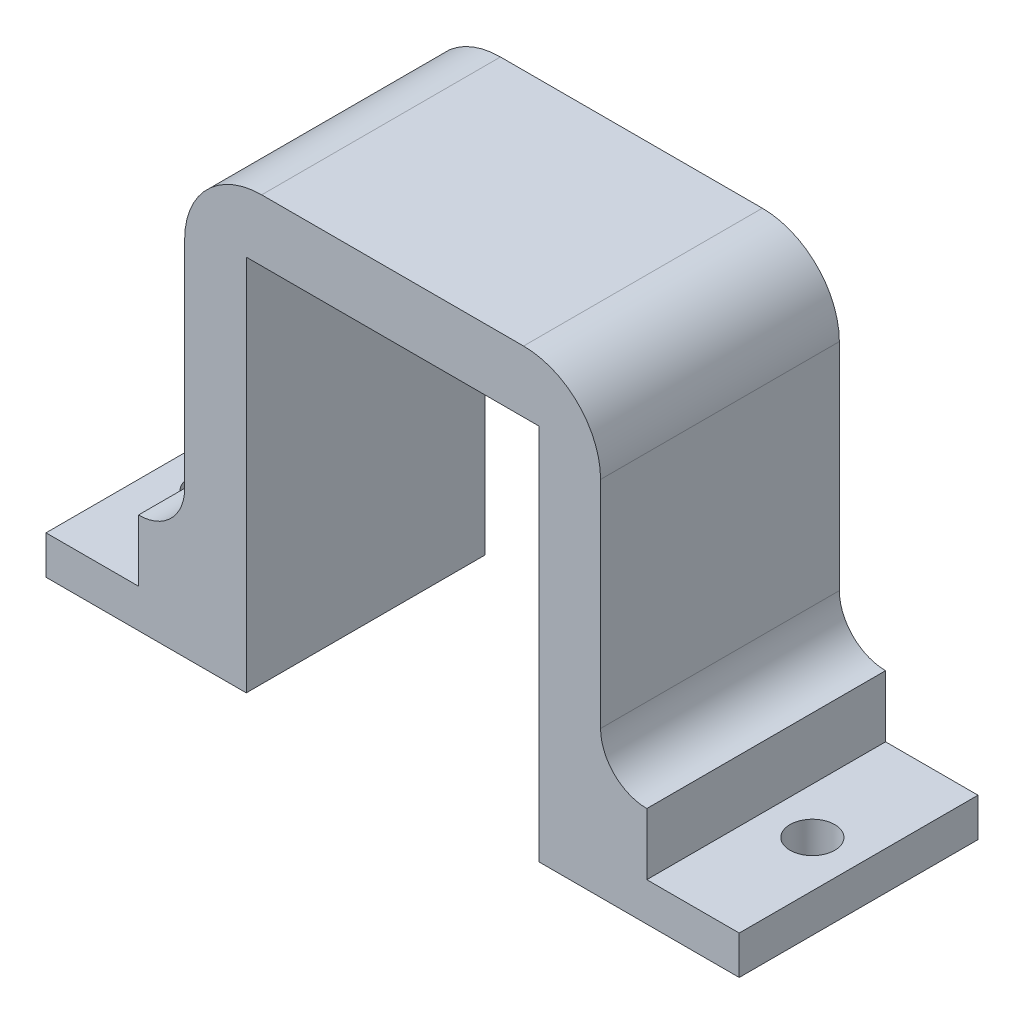
ISO-10303-21;
HEADER;
FILE_DESCRIPTION(('STEP AP214'),'2;1');
FILE_NAME('part.step','',(''),(''),'','','');
FILE_SCHEMA(('AUTOMOTIVE_DESIGN { 1 0 10303 214 1 1 1 1 }'));
ENDSEC;
DATA;
#1=APPLICATION_CONTEXT('core data for automotive mechanical design processes');
#2=APPLICATION_PROTOCOL_DEFINITION('international standard','automotive_design',2000,#1);
#3=PRODUCT_CONTEXT('',#1,'mechanical');
#4=PRODUCT('Part','Part','',(#3));
#5=PRODUCT_RELATED_PRODUCT_CATEGORY('part','',(#4));
#6=PRODUCT_DEFINITION_FORMATION('','',#4);
#7=PRODUCT_DEFINITION_CONTEXT('part definition',#1,'design');
#8=PRODUCT_DEFINITION('design','',#6,#7);
#9=PRODUCT_DEFINITION_SHAPE('','',#8);
#10=(LENGTH_UNIT() NAMED_UNIT(*) SI_UNIT(.MILLI.,.METRE.));
#11=(NAMED_UNIT(*) PLANE_ANGLE_UNIT() SI_UNIT($,.RADIAN.));
#12=(NAMED_UNIT(*) SI_UNIT($,.STERADIAN.) SOLID_ANGLE_UNIT());
#13=UNCERTAINTY_MEASURE_WITH_UNIT(LENGTH_MEASURE(1.E-05),#10,'distance_accuracy_value','');
#14=(GEOMETRIC_REPRESENTATION_CONTEXT(3) GLOBAL_UNCERTAINTY_ASSIGNED_CONTEXT((#13)) GLOBAL_UNIT_ASSIGNED_CONTEXT((#10,
#11,#12)) REPRESENTATION_CONTEXT('',''));
#15=CARTESIAN_POINT('',(0.,0.,0.));
#16=DIRECTION('',(0.,0.,1.));
#17=DIRECTION('',(1.,0.,0.));
#18=AXIS2_PLACEMENT_3D('',#15,#16,#17);
#19=CARTESIAN_POINT('',(0.,3.00000000000002,23.));
#20=DIRECTION('',(1.,0.,0.));
#21=DIRECTION('',(0.,0.,-1.));
#22=AXIS2_PLACEMENT_3D('',#19,#20,#21);
#23=PLANE('',#22);
#24=DIRECTION('',(0.,1.,0.));
#25=VECTOR('',#24,1.);
#26=CARTESIAN_POINT('',(0.,3.00000000000002,7.5));
#27=LINE('',#26,#25);
#28=CARTESIAN_POINT('',(0.,3.00000000000002,7.5));
#29=VERTEX_POINT('',#28);
#30=CARTESIAN_POINT('',(0.,17.,7.5));
#31=VERTEX_POINT('',#30);
#32=EDGE_CURVE('E292',#29,#31,#27,.T.);
#33=ORIENTED_EDGE('',*,*,#32,.F.);
#34=DIRECTION('',(0.,0.,-1.));
#35=VECTOR('',#34,1.);
#36=CARTESIAN_POINT('',(0.,3.00000000000002,23.));
#37=LINE('',#36,#35);
#38=CARTESIAN_POINT('',(0.,3.00000000000002,23.));
#39=VERTEX_POINT('',#38);
#40=EDGE_CURVE('E342',#39,#29,#37,.T.);
#41=ORIENTED_EDGE('',*,*,#40,.F.);
#42=DIRECTION('',(0.,-1.,0.));
#43=VECTOR('',#42,1.);
#44=CARTESIAN_POINT('',(0.,3.00000000000002,23.));
#45=LINE('',#44,#43);
#46=CARTESIAN_POINT('',(0.,17.,23.));
#47=VERTEX_POINT('',#46);
#48=EDGE_CURVE('E313',#47,#39,#45,.T.);
#49=ORIENTED_EDGE('',*,*,#48,.F.);
#50=DIRECTION('',(0.,0.,-1.));
#51=VECTOR('',#50,1.);
#52=CARTESIAN_POINT('',(0.,17.,23.));
#53=LINE('',#52,#51);
#54=EDGE_CURVE('E346',#47,#31,#53,.T.);
#55=ORIENTED_EDGE('',*,*,#54,.T.);
#56=EDGE_LOOP('',(#33,#41,#49,#55));
#57=FACE_BOUND('',#56,.T.);
#58=ADVANCED_FACE('F45',(#57),#23,.F.);
#59=CARTESIAN_POINT('',(-3.,3.,23.));
#60=DIRECTION('',(0.,0.,-1.));
#61=DIRECTION('',(-1.,0.,0.));
#62=AXIS2_PLACEMENT_3D('',#59,#60,#61);
#63=CYLINDRICAL_SURFACE('',#62,3.);
#64=CARTESIAN_POINT('',(-3.,3.,7.5));
#65=DIRECTION('',(0.,0.,-1.));
#66=DIRECTION('',(0.,1.,0.));
#67=AXIS2_PLACEMENT_3D('',#64,#65,#66);
#68=CIRCLE('',#67,3.);
#69=CARTESIAN_POINT('',(-3.00000000000002,0.,7.5));
#70=VERTEX_POINT('',#69);
#71=EDGE_CURVE('E289',#70,#29,#68,.F.);
#72=ORIENTED_EDGE('',*,*,#71,.F.);
#73=DIRECTION('',(0.,0.,-1.));
#74=VECTOR('',#73,1.);
#75=CARTESIAN_POINT('',(-3.00000000000002,0.,23.));
#76=LINE('',#75,#74);
#77=CARTESIAN_POINT('',(-3.,0.,23.));
#78=VERTEX_POINT('',#77);
#79=EDGE_CURVE('E339',#78,#70,#76,.T.);
#80=ORIENTED_EDGE('',*,*,#79,.F.);
#81=CARTESIAN_POINT('',(-3.,3.,23.));
#82=DIRECTION('',(0.,0.,-1.));
#83=DIRECTION('',(-1.,0.,0.));
#84=AXIS2_PLACEMENT_3D('',#81,#82,#83);
#85=CIRCLE('',#84,3.);
#86=EDGE_CURVE('E316',#39,#78,#85,.T.);
#87=ORIENTED_EDGE('',*,*,#86,.F.);
#88=ORIENTED_EDGE('',*,*,#40,.T.);
#89=EDGE_LOOP('',(#72,#80,#87,#88));
#90=FACE_BOUND('',#89,.T.);
#91=ADVANCED_FACE('F398',(#90),#63,.F.);
#92=CARTESIAN_POINT('',(-9.,-4.,23.));
#93=DIRECTION('',(1.,0.,0.));
#94=DIRECTION('',(0.,1.,0.));
#95=AXIS2_PLACEMENT_3D('',#92,#93,#94);
#96=PLANE('',#95);
#97=DIRECTION('',(0.,-1.,0.));
#98=VECTOR('',#97,1.);
#99=CARTESIAN_POINT('',(-9.,-4.,23.));
#100=LINE('',#99,#98);
#101=CARTESIAN_POINT('',(-9.,-3.99999999999999,23.));
#102=VERTEX_POINT('',#101);
#103=CARTESIAN_POINT('',(-8.99999999999999,-6.50000000000001,23.));
#104=VERTEX_POINT('',#103);
#105=EDGE_CURVE('E320',#102,#104,#100,.T.);
#106=ORIENTED_EDGE('',*,*,#105,.F.);
#107=DIRECTION('',(0.,0.,1.));
#108=VECTOR('',#107,1.);
#109=CARTESIAN_POINT('',(-9.,-3.99999999999999,7.5));
#110=LINE('',#109,#108);
#111=CARTESIAN_POINT('',(-9.,-3.99999999999999,7.5));
#112=VERTEX_POINT('',#111);
#113=EDGE_CURVE('E206',#112,#102,#110,.T.);
#114=ORIENTED_EDGE('',*,*,#113,.F.);
#115=DIRECTION('',(0.,1.,0.));
#116=VECTOR('',#115,1.);
#117=CARTESIAN_POINT('',(-9.,-4.,7.5));
#118=LINE('',#117,#116);
#119=CARTESIAN_POINT('',(-8.99999999999999,-6.50000000000001,7.5));
#120=VERTEX_POINT('',#119);
#121=EDGE_CURVE('E285',#120,#112,#118,.T.);
#122=ORIENTED_EDGE('',*,*,#121,.F.);
#123=DIRECTION('',(0.,0.,-1.));
#124=VECTOR('',#123,1.);
#125=CARTESIAN_POINT('',(-8.99999999999999,-6.50000000000001,23.));
#126=LINE('',#125,#124);
#127=EDGE_CURVE('E245',#104,#120,#126,.T.);
#128=ORIENTED_EDGE('',*,*,#127,.F.);
#129=EDGE_LOOP('',(#106,#114,#122,#128));
#130=FACE_BOUND('',#129,.T.);
#131=ADVANCED_FACE('F405',(#130),#96,.F.);
#132=CARTESIAN_POINT('',(4.,18.,23.));
#133=DIRECTION('',(-1.,0.,0.));
#134=DIRECTION('',(0.,-1.,0.));
#135=AXIS2_PLACEMENT_3D('',#132,#133,#134);
#136=PLANE('',#135);
#137=DIRECTION('',(0.,-1.,0.));
#138=VECTOR('',#137,1.);
#139=CARTESIAN_POINT('',(4.,18.,7.5));
#140=LINE('',#139,#138);
#141=CARTESIAN_POINT('',(4.,18.,7.5));
#142=VERTEX_POINT('',#141);
#143=CARTESIAN_POINT('',(4.,-6.50000000000001,7.5));
#144=VERTEX_POINT('',#143);
#145=EDGE_CURVE('E11',#142,#144,#140,.T.);
#146=ORIENTED_EDGE('',*,*,#145,.F.);
#147=DIRECTION('',(0.,0.,-1.));
#148=VECTOR('',#147,1.);
#149=CARTESIAN_POINT('',(4.,18.,23.));
#150=LINE('',#149,#148);
#151=CARTESIAN_POINT('',(4.,18.,23.));
#152=VERTEX_POINT('',#151);
#153=EDGE_CURVE('E335',#152,#142,#150,.T.);
#154=ORIENTED_EDGE('',*,*,#153,.F.);
#155=DIRECTION('',(0.,1.,0.));
#156=VECTOR('',#155,1.);
#157=CARTESIAN_POINT('',(4.,18.,23.));
#158=LINE('',#157,#156);
#159=CARTESIAN_POINT('',(4.,-6.50000000000001,23.));
#160=VERTEX_POINT('',#159);
#161=EDGE_CURVE('E323',#160,#152,#158,.T.);
#162=ORIENTED_EDGE('',*,*,#161,.F.);
#163=DIRECTION('',(0.,0.,1.));
#164=VECTOR('',#163,1.);
#165=CARTESIAN_POINT('',(4.,-6.50000000000001,23.));
#166=LINE('',#165,#164);
#167=EDGE_CURVE('E228',#144,#160,#166,.T.);
#168=ORIENTED_EDGE('',*,*,#167,.F.);
#169=EDGE_LOOP('',(#146,#154,#162,#168));
#170=FACE_BOUND('',#169,.T.);
#171=ADVANCED_FACE('F433',(#170),#136,.F.);
#172=CARTESIAN_POINT('',(36.,0.,23.));
#173=DIRECTION('',(-1.,0.,0.));
#174=DIRECTION('',(0.,0.,1.));
#175=AXIS2_PLACEMENT_3D('',#172,#173,#174);
#176=PLANE('',#175);
#177=DIRECTION('',(0.,1.,0.));
#178=VECTOR('',#177,1.);
#179=CARTESIAN_POINT('',(36.,-4.00000000000001,7.5));
#180=LINE('',#179,#178);
#181=CARTESIAN_POINT('',(36.,-6.5,7.5));
#182=VERTEX_POINT('',#181);
#183=CARTESIAN_POINT('',(36.,-4.,7.5));
#184=VERTEX_POINT('',#183);
#185=EDGE_CURVE('E259',#182,#184,#180,.T.);
#186=ORIENTED_EDGE('',*,*,#185,.T.);
#187=DIRECTION('',(0.,0.,-1.));
#188=VECTOR('',#187,1.);
#189=CARTESIAN_POINT('',(36.,-4.,23.));
#190=LINE('',#189,#188);
#191=CARTESIAN_POINT('',(36.,-4.,23.));
#192=VERTEX_POINT('',#191);
#193=EDGE_CURVE('E187',#192,#184,#190,.T.);
#194=ORIENTED_EDGE('',*,*,#193,.F.);
#195=DIRECTION('',(0.,1.,0.));
#196=VECTOR('',#195,1.);
#197=CARTESIAN_POINT('',(36.,0.,23.));
#198=LINE('',#197,#196);
#199=CARTESIAN_POINT('',(36.,-6.5,23.));
#200=VERTEX_POINT('',#199);
#201=EDGE_CURVE('E192',#200,#192,#198,.T.);
#202=ORIENTED_EDGE('',*,*,#201,.F.);
#203=DIRECTION('',(0.,0.,1.));
#204=VECTOR('',#203,1.);
#205=CARTESIAN_POINT('',(36.,-6.5,23.));
#206=LINE('',#205,#204);
#207=EDGE_CURVE('E232',#182,#200,#206,.T.);
#208=ORIENTED_EDGE('',*,*,#207,.F.);
#209=EDGE_LOOP('',(#186,#194,#202,#208));
#210=FACE_BOUND('',#209,.T.);
#211=ADVANCED_FACE('F47',(#210),#176,.F.);
#212=CARTESIAN_POINT('',(30.,3.,23.));
#213=DIRECTION('',(0.,0.,-1.));
#214=DIRECTION('',(-1.,0.,0.));
#215=AXIS2_PLACEMENT_3D('',#212,#213,#214);
#216=CYLINDRICAL_SURFACE('',#215,3.);
#217=DIRECTION('',(0.,0.,-1.));
#218=VECTOR('',#217,1.);
#219=CARTESIAN_POINT('',(30.,0.,23.));
#220=LINE('',#219,#218);
#221=CARTESIAN_POINT('',(30.,0.,23.));
#222=VERTEX_POINT('',#221);
#223=CARTESIAN_POINT('',(30.,0.,7.5));
#224=VERTEX_POINT('',#223);
#225=EDGE_CURVE('E55',#222,#224,#220,.T.);
#226=ORIENTED_EDGE('',*,*,#225,.T.);
#227=CARTESIAN_POINT('',(30.,3.,7.5));
#228=DIRECTION('',(0.,0.,1.));
#229=DIRECTION('',(1.,0.,0.));
#230=AXIS2_PLACEMENT_3D('',#227,#228,#229);
#231=CIRCLE('',#230,3.);
#232=CARTESIAN_POINT('',(27.,3.,7.5));
#233=VERTEX_POINT('',#232);
#234=EDGE_CURVE('E281',#224,#233,#231,.F.);
#235=ORIENTED_EDGE('',*,*,#234,.T.);
#236=DIRECTION('',(0.,0.,-1.));
#237=VECTOR('',#236,1.);
#238=CARTESIAN_POINT('',(27.,3.,23.));
#239=LINE('',#238,#237);
#240=CARTESIAN_POINT('',(27.,3.,23.));
#241=VERTEX_POINT('',#240);
#242=EDGE_CURVE('E362',#241,#233,#239,.T.);
#243=ORIENTED_EDGE('',*,*,#242,.F.);
#244=CARTESIAN_POINT('',(30.,3.,23.));
#245=DIRECTION('',(0.,0.,-1.));
#246=DIRECTION('',(-1.,0.,0.));
#247=AXIS2_PLACEMENT_3D('',#244,#245,#246);
#248=CIRCLE('',#247,3.);
#249=EDGE_CURVE('E298',#222,#241,#248,.T.);
#250=ORIENTED_EDGE('',*,*,#249,.F.);
#251=EDGE_LOOP('',(#226,#235,#243,#250));
#252=FACE_BOUND('',#251,.T.);
#253=ADVANCED_FACE('F425',(#252),#216,.F.);
#254=CARTESIAN_POINT('',(27.,17.,23.));
#255=DIRECTION('',(-1.,0.,0.));
#256=DIRECTION('',(0.,-1.,0.));
#257=AXIS2_PLACEMENT_3D('',#254,#255,#256);
#258=PLANE('',#257);
#259=ORIENTED_EDGE('',*,*,#242,.T.);
#260=DIRECTION('',(0.,1.,0.));
#261=VECTOR('',#260,1.);
#262=CARTESIAN_POINT('',(27.,17.,7.5));
#263=LINE('',#262,#261);
#264=CARTESIAN_POINT('',(27.,17.,7.5));
#265=VERTEX_POINT('',#264);
#266=EDGE_CURVE('E277',#233,#265,#263,.T.);
#267=ORIENTED_EDGE('',*,*,#266,.T.);
#268=DIRECTION('',(0.,0.,-1.));
#269=VECTOR('',#268,1.);
#270=CARTESIAN_POINT('',(27.,17.,23.));
#271=LINE('',#270,#269);
#272=CARTESIAN_POINT('',(27.,17.,23.));
#273=VERTEX_POINT('',#272);
#274=EDGE_CURVE('E358',#273,#265,#271,.T.);
#275=ORIENTED_EDGE('',*,*,#274,.F.);
#276=DIRECTION('',(0.,1.,0.));
#277=VECTOR('',#276,1.);
#278=CARTESIAN_POINT('',(27.,17.,23.));
#279=LINE('',#278,#277);
#280=EDGE_CURVE('E301',#241,#273,#279,.T.);
#281=ORIENTED_EDGE('',*,*,#280,.F.);
#282=EDGE_LOOP('',(#259,#267,#275,#281));
#283=FACE_BOUND('',#282,.T.);
#284=ADVANCED_FACE('F423',(#283),#258,.F.);
#285=CARTESIAN_POINT('',(22.,17.,23.));
#286=DIRECTION('',(0.,0.,-1.));
#287=DIRECTION('',(-1.,0.,0.));
#288=AXIS2_PLACEMENT_3D('',#285,#286,#287);
#289=CYLINDRICAL_SURFACE('',#288,5.);
#290=ORIENTED_EDGE('',*,*,#274,.T.);
#291=CARTESIAN_POINT('',(22.,17.,7.5));
#292=DIRECTION('',(0.,0.,1.));
#293=DIRECTION('',(1.,0.,0.));
#294=AXIS2_PLACEMENT_3D('',#291,#292,#293);
#295=CIRCLE('',#294,5.);
#296=CARTESIAN_POINT('',(22.,22.,7.5));
#297=VERTEX_POINT('',#296);
#298=EDGE_CURVE('E273',#265,#297,#295,.T.);
#299=ORIENTED_EDGE('',*,*,#298,.T.);
#300=DIRECTION('',(0.,0.,-1.));
#301=VECTOR('',#300,1.);
#302=CARTESIAN_POINT('',(22.,22.,23.));
#303=LINE('',#302,#301);
#304=CARTESIAN_POINT('',(22.,22.,23.));
#305=VERTEX_POINT('',#304);
#306=EDGE_CURVE('E354',#305,#297,#303,.T.);
#307=ORIENTED_EDGE('',*,*,#306,.F.);
#308=CARTESIAN_POINT('',(22.,17.,23.));
#309=DIRECTION('',(0.,0.,1.));
#310=DIRECTION('',(-1.,0.,0.));
#311=AXIS2_PLACEMENT_3D('',#308,#309,#310);
#312=CIRCLE('',#311,5.);
#313=EDGE_CURVE('E304',#273,#305,#312,.T.);
#314=ORIENTED_EDGE('',*,*,#313,.F.);
#315=EDGE_LOOP('',(#290,#299,#307,#314));
#316=FACE_BOUND('',#315,.T.);
#317=ADVANCED_FACE('F419',(#316),#289,.T.);
#318=CARTESIAN_POINT('',(5.00000000000004,22.,23.));
#319=DIRECTION('',(0.,-1.,0.));
#320=DIRECTION('',(0.,0.,-1.));
#321=AXIS2_PLACEMENT_3D('',#318,#319,#320);
#322=PLANE('',#321);
#323=ORIENTED_EDGE('',*,*,#306,.T.);
#324=DIRECTION('',(1.,0.,0.));
#325=VECTOR('',#324,1.);
#326=CARTESIAN_POINT('',(-9.,22.,7.5));
#327=LINE('',#326,#325);
#328=CARTESIAN_POINT('',(5.,22.,7.5));
#329=VERTEX_POINT('',#328);
#330=EDGE_CURVE('E240',#329,#297,#327,.T.);
#331=ORIENTED_EDGE('',*,*,#330,.F.);
#332=DIRECTION('',(0.,0.,-1.));
#333=VECTOR('',#332,1.);
#334=CARTESIAN_POINT('',(5.00000000000004,22.,23.));
#335=LINE('',#334,#333);
#336=CARTESIAN_POINT('',(5.00000000000004,22.,23.));
#337=VERTEX_POINT('',#336);
#338=EDGE_CURVE('E350',#337,#329,#335,.T.);
#339=ORIENTED_EDGE('',*,*,#338,.F.);
#340=DIRECTION('',(-1.,0.,0.));
#341=VECTOR('',#340,1.);
#342=CARTESIAN_POINT('',(5.00000000000004,22.,23.));
#343=LINE('',#342,#341);
#344=EDGE_CURVE('E307',#305,#337,#343,.T.);
#345=ORIENTED_EDGE('',*,*,#344,.F.);
#346=EDGE_LOOP('',(#323,#331,#339,#345));
#347=FACE_BOUND('',#346,.T.);
#348=ADVANCED_FACE('F415',(#347),#322,.F.);
#349=CARTESIAN_POINT('',(5.,17.,23.));
#350=DIRECTION('',(0.,0.,-1.));
#351=DIRECTION('',(-1.,0.,0.));
#352=AXIS2_PLACEMENT_3D('',#349,#350,#351);
#353=CYLINDRICAL_SURFACE('',#352,5.);
#354=ORIENTED_EDGE('',*,*,#338,.T.);
#355=CARTESIAN_POINT('',(5.,17.,7.5));
#356=DIRECTION('',(0.,0.,1.));
#357=DIRECTION('',(1.,0.,0.));
#358=AXIS2_PLACEMENT_3D('',#355,#356,#357);
#359=CIRCLE('',#358,5.);
#360=EDGE_CURVE('E263',#329,#31,#359,.T.);
#361=ORIENTED_EDGE('',*,*,#360,.T.);
#362=ORIENTED_EDGE('',*,*,#54,.F.);
#363=CARTESIAN_POINT('',(5.,17.,23.));
#364=DIRECTION('',(0.,0.,1.));
#365=DIRECTION('',(1.,0.,0.));
#366=AXIS2_PLACEMENT_3D('',#363,#364,#365);
#367=CIRCLE('',#366,5.);
#368=EDGE_CURVE('E310',#337,#47,#367,.T.);
#369=ORIENTED_EDGE('',*,*,#368,.F.);
#370=EDGE_LOOP('',(#354,#361,#362,#369));
#371=FACE_BOUND('',#370,.T.);
#372=ADVANCED_FACE('F411',(#371),#353,.T.);
#373=CARTESIAN_POINT('',(23.,18.,23.));
#374=DIRECTION('',(0.,1.,0.));
#375=DIRECTION('',(-1.,0.,0.));
#376=AXIS2_PLACEMENT_3D('',#373,#374,#375);
#377=PLANE('',#376);
#378=ORIENTED_EDGE('',*,*,#153,.T.);
#379=DIRECTION('',(1.,0.,0.));
#380=VECTOR('',#379,1.);
#381=CARTESIAN_POINT('',(23.,18.,7.5));
#382=LINE('',#381,#380);
#383=CARTESIAN_POINT('',(23.,18.,7.5));
#384=VERTEX_POINT('',#383);
#385=EDGE_CURVE('E266',#142,#384,#382,.T.);
#386=ORIENTED_EDGE('',*,*,#385,.T.);
#387=DIRECTION('',(0.,0.,-1.));
#388=VECTOR('',#387,1.);
#389=CARTESIAN_POINT('',(23.,18.,23.));
#390=LINE('',#389,#388);
#391=CARTESIAN_POINT('',(23.,18.,23.));
#392=VERTEX_POINT('',#391);
#393=EDGE_CURVE('E331',#392,#384,#390,.T.);
#394=ORIENTED_EDGE('',*,*,#393,.F.);
#395=DIRECTION('',(1.,0.,0.));
#396=VECTOR('',#395,1.);
#397=CARTESIAN_POINT('',(23.,18.,23.));
#398=LINE('',#397,#396);
#399=EDGE_CURVE('E71',#152,#392,#398,.T.);
#400=ORIENTED_EDGE('',*,*,#399,.F.);
#401=EDGE_LOOP('',(#378,#386,#394,#400));
#402=FACE_BOUND('',#401,.T.);
#403=ADVANCED_FACE('F414',(#402),#377,.F.);
#404=CARTESIAN_POINT('',(23.,-4.,23.));
#405=DIRECTION('',(1.,0.,0.));
#406=DIRECTION('',(0.,0.,-1.));
#407=AXIS2_PLACEMENT_3D('',#404,#405,#406);
#408=PLANE('',#407);
#409=ORIENTED_EDGE('',*,*,#393,.T.);
#410=DIRECTION('',(0.,-1.,0.));
#411=VECTOR('',#410,1.);
#412=CARTESIAN_POINT('',(23.,-4.,7.5));
#413=LINE('',#412,#411);
#414=CARTESIAN_POINT('',(23.,-6.5,7.5));
#415=VERTEX_POINT('',#414);
#416=EDGE_CURVE('E270',#384,#415,#413,.T.);
#417=ORIENTED_EDGE('',*,*,#416,.T.);
#418=DIRECTION('',(0.,0.,-1.));
#419=VECTOR('',#418,1.);
#420=CARTESIAN_POINT('',(23.,-6.5,23.));
#421=LINE('',#420,#419);
#422=CARTESIAN_POINT('',(23.,-6.5,23.));
#423=VERTEX_POINT('',#422);
#424=EDGE_CURVE('E223',#423,#415,#421,.T.);
#425=ORIENTED_EDGE('',*,*,#424,.F.);
#426=DIRECTION('',(0.,-1.,0.));
#427=VECTOR('',#426,1.);
#428=CARTESIAN_POINT('',(23.,-4.,23.));
#429=LINE('',#428,#427);
#430=EDGE_CURVE('E328',#392,#423,#429,.T.);
#431=ORIENTED_EDGE('',*,*,#430,.F.);
#432=EDGE_LOOP('',(#409,#417,#425,#431));
#433=FACE_BOUND('',#432,.T.);
#434=ADVANCED_FACE('F471',(#433),#408,.F.);
#435=CARTESIAN_POINT('',(-3.,3.,23.));
#436=DIRECTION('',(0.,0.,-1.));
#437=DIRECTION('',(-1.,0.,0.));
#438=AXIS2_PLACEMENT_3D('',#435,#436,#437);
#439=PLANE('',#438);
#440=ORIENTED_EDGE('',*,*,#201,.T.);
#441=DIRECTION('',(1.,0.,0.));
#442=VECTOR('',#441,1.);
#443=CARTESIAN_POINT('',(30.,-4.,23.));
#444=LINE('',#443,#442);
#445=CARTESIAN_POINT('',(30.,-4.,23.));
#446=VERTEX_POINT('',#445);
#447=EDGE_CURVE('E173',#446,#192,#444,.T.);
#448=ORIENTED_EDGE('',*,*,#447,.F.);
#449=DIRECTION('',(0.,-1.,0.));
#450=VECTOR('',#449,1.);
#451=CARTESIAN_POINT('',(30.,0.,23.));
#452=LINE('',#451,#450);
#453=EDGE_CURVE('E180',#222,#446,#452,.T.);
#454=ORIENTED_EDGE('',*,*,#453,.F.);
#455=ORIENTED_EDGE('',*,*,#249,.T.);
#456=ORIENTED_EDGE('',*,*,#280,.T.);
#457=ORIENTED_EDGE('',*,*,#313,.T.);
#458=ORIENTED_EDGE('',*,*,#344,.T.);
#459=ORIENTED_EDGE('',*,*,#368,.T.);
#460=ORIENTED_EDGE('',*,*,#48,.T.);
#461=ORIENTED_EDGE('',*,*,#86,.T.);
#462=DIRECTION('',(0.,1.,0.));
#463=VECTOR('',#462,1.);
#464=CARTESIAN_POINT('',(-3.,0.,23.));
#465=LINE('',#464,#463);
#466=CARTESIAN_POINT('',(-3.,-4.,23.));
#467=VERTEX_POINT('',#466);
#468=EDGE_CURVE('E210',#467,#78,#465,.T.);
#469=ORIENTED_EDGE('',*,*,#468,.F.);
#470=DIRECTION('',(-1.,0.,0.));
#471=VECTOR('',#470,1.);
#472=CARTESIAN_POINT('',(-3.,-4.,23.));
#473=LINE('',#472,#471);
#474=EDGE_CURVE('E216',#467,#102,#473,.T.);
#475=ORIENTED_EDGE('',*,*,#474,.T.);
#476=ORIENTED_EDGE('',*,*,#105,.T.);
#477=DIRECTION('',(-1.,0.,0.));
#478=VECTOR('',#477,1.);
#479=CARTESIAN_POINT('',(4.,-6.50000000000001,23.));
#480=LINE('',#479,#478);
#481=EDGE_CURVE('E250',#160,#104,#480,.T.);
#482=ORIENTED_EDGE('',*,*,#481,.F.);
#483=ORIENTED_EDGE('',*,*,#161,.T.);
#484=ORIENTED_EDGE('',*,*,#399,.T.);
#485=ORIENTED_EDGE('',*,*,#430,.T.);
#486=DIRECTION('',(-1.,0.,0.));
#487=VECTOR('',#486,1.);
#488=CARTESIAN_POINT('',(23.,-6.5,23.));
#489=LINE('',#488,#487);
#490=EDGE_CURVE('E236',#200,#423,#489,.T.);
#491=ORIENTED_EDGE('',*,*,#490,.F.);
#492=EDGE_LOOP('',(#440,#448,#454,#455,#456,#457,#458,#459,#460,#461,#469,#475,#476,#482,#483,
#484,#485,#491));
#493=FACE_BOUND('',#492,.T.);
#494=ADVANCED_FACE('F190',(#493),#439,.F.);
#495=CARTESIAN_POINT('',(-23.,17.,7.5));
#496=DIRECTION('',(0.,0.,-1.));
#497=DIRECTION('',(0.,1.,0.));
#498=AXIS2_PLACEMENT_3D('',#495,#496,#497);
#499=PLANE('',#498);
#500=DIRECTION('',(1.,0.,0.));
#501=VECTOR('',#500,1.);
#502=CARTESIAN_POINT('',(30.,-4.,7.5));
#503=LINE('',#502,#501);
#504=CARTESIAN_POINT('',(30.,-4.,7.5));
#505=VERTEX_POINT('',#504);
#506=EDGE_CURVE('E176',#505,#184,#503,.T.);
#507=ORIENTED_EDGE('',*,*,#506,.T.);
#508=ORIENTED_EDGE('',*,*,#185,.F.);
#509=DIRECTION('',(1.,0.,0.));
#510=VECTOR('',#509,1.);
#511=CARTESIAN_POINT('',(23.,-6.5,7.5));
#512=LINE('',#511,#510);
#513=EDGE_CURVE('E227',#415,#182,#512,.T.);
#514=ORIENTED_EDGE('',*,*,#513,.F.);
#515=ORIENTED_EDGE('',*,*,#416,.F.);
#516=ORIENTED_EDGE('',*,*,#385,.F.);
#517=ORIENTED_EDGE('',*,*,#145,.T.);
#518=DIRECTION('',(1.,0.,0.));
#519=VECTOR('',#518,1.);
#520=CARTESIAN_POINT('',(4.,-6.50000000000001,7.5));
#521=LINE('',#520,#519);
#522=EDGE_CURVE('E241',#120,#144,#521,.T.);
#523=ORIENTED_EDGE('',*,*,#522,.F.);
#524=ORIENTED_EDGE('',*,*,#121,.T.);
#525=DIRECTION('',(-1.,0.,0.));
#526=VECTOR('',#525,1.);
#527=CARTESIAN_POINT('',(-3.,-4.,7.5));
#528=LINE('',#527,#526);
#529=CARTESIAN_POINT('',(-3.,-4.,7.5));
#530=VERTEX_POINT('',#529);
#531=EDGE_CURVE('E213',#530,#112,#528,.T.);
#532=ORIENTED_EDGE('',*,*,#531,.F.);
#533=DIRECTION('',(0.,-1.,0.));
#534=VECTOR('',#533,1.);
#535=CARTESIAN_POINT('',(-3.,0.,7.5));
#536=LINE('',#535,#534);
#537=EDGE_CURVE('E201',#70,#530,#536,.T.);
#538=ORIENTED_EDGE('',*,*,#537,.F.);
#539=ORIENTED_EDGE('',*,*,#71,.T.);
#540=ORIENTED_EDGE('',*,*,#32,.T.);
#541=ORIENTED_EDGE('',*,*,#360,.F.);
#542=ORIENTED_EDGE('',*,*,#330,.T.);
#543=ORIENTED_EDGE('',*,*,#298,.F.);
#544=ORIENTED_EDGE('',*,*,#266,.F.);
#545=ORIENTED_EDGE('',*,*,#234,.F.);
#546=DIRECTION('',(0.,1.,0.));
#547=VECTOR('',#546,1.);
#548=CARTESIAN_POINT('',(30.,0.,7.5));
#549=LINE('',#548,#547);
#550=EDGE_CURVE('E179',#505,#224,#549,.T.);
#551=ORIENTED_EDGE('',*,*,#550,.F.);
#552=EDGE_LOOP('',(#507,#508,#514,#515,#516,#517,#523,#524,#532,#538,#539,#540,#541,#542,#543,
#544,#545,#551));
#553=FACE_BOUND('',#552,.T.);
#554=ADVANCED_FACE('F460',(#553),#499,.T.);
#555=CARTESIAN_POINT('',(33.,-50.,15.25));
#556=DIRECTION('',(0.,1.,0.));
#557=DIRECTION('',(0.,0.,1.));
#558=AXIS2_PLACEMENT_3D('',#555,#556,#557);
#559=CYLINDRICAL_SURFACE('',#558,1.45);
#560=CARTESIAN_POINT('',(33.,-4.,15.25));
#561=DIRECTION('',(0.,-1.,0.));
#562=DIRECTION('',(0.,0.,-1.));
#563=AXIS2_PLACEMENT_3D('',#560,#561,#562);
#564=CIRCLE('',#563,1.45);
#565=CARTESIAN_POINT('',(33.,-4.,13.8));
#566=VERTEX_POINT('',#565);
#567=EDGE_CURVE('E49',#566,#566,#564,.F.);
#568=ORIENTED_EDGE('',*,*,#567,.T.);
#569=EDGE_LOOP('',(#568));
#570=FACE_BOUND('',#569,.T.);
#571=CARTESIAN_POINT('',(33.,-6.5,15.25));
#572=DIRECTION('',(0.,-1.,0.));
#573=DIRECTION('',(1.,0.,0.));
#574=AXIS2_PLACEMENT_3D('',#571,#572,#573);
#575=CIRCLE('',#574,1.45);
#576=CARTESIAN_POINT('',(34.45,-6.5,15.25));
#577=VERTEX_POINT('',#576);
#578=EDGE_CURVE('E368',#577,#577,#575,.T.);
#579=ORIENTED_EDGE('',*,*,#578,.T.);
#580=EDGE_LOOP('',(#579));
#581=FACE_BOUND('',#580,.T.);
#582=ADVANCED_FACE('F499',(#570,#581),#559,.F.);
#583=CARTESIAN_POINT('',(-6.00000000000001,-50.,15.25));
#584=DIRECTION('',(0.,1.,0.));
#585=DIRECTION('',(0.,0.,1.));
#586=AXIS2_PLACEMENT_3D('',#583,#584,#585);
#587=CYLINDRICAL_SURFACE('',#586,1.45);
#588=CARTESIAN_POINT('',(-6.00000000000001,-4.,15.25));
#589=DIRECTION('',(0.,-1.,0.));
#590=DIRECTION('',(1.,0.,0.));
#591=AXIS2_PLACEMENT_3D('',#588,#589,#590);
#592=CIRCLE('',#591,1.45);
#593=CARTESIAN_POINT('',(-4.55000000000001,-4.,15.25));
#594=VERTEX_POINT('',#593);
#595=EDGE_CURVE('E220',#594,#594,#592,.F.);
#596=ORIENTED_EDGE('',*,*,#595,.T.);
#597=EDGE_LOOP('',(#596));
#598=FACE_BOUND('',#597,.T.);
#599=CARTESIAN_POINT('',(-6.,-6.50000000000001,15.25));
#600=DIRECTION('',(0.,1.,0.));
#601=DIRECTION('',(-1.,0.,0.));
#602=AXIS2_PLACEMENT_3D('',#599,#600,#601);
#603=CIRCLE('',#602,1.45);
#604=CARTESIAN_POINT('',(-7.45,-6.50000000000001,15.25));
#605=VERTEX_POINT('',#604);
#606=EDGE_CURVE('E246',#605,#605,#603,.T.);
#607=ORIENTED_EDGE('',*,*,#606,.F.);
#608=EDGE_LOOP('',(#607));
#609=FACE_BOUND('',#608,.T.);
#610=ADVANCED_FACE('F378',(#598,#609),#587,.F.);
#611=CARTESIAN_POINT('',(0.,-6.50000000000001,0.));
#612=DIRECTION('',(0.,1.,0.));
#613=DIRECTION('',(-1.,0.,0.));
#614=AXIS2_PLACEMENT_3D('',#611,#612,#613);
#615=PLANE('',#614);
#616=ORIENTED_EDGE('',*,*,#606,.T.);
#617=EDGE_LOOP('',(#616));
#618=FACE_BOUND('',#617,.T.);
#619=ORIENTED_EDGE('',*,*,#167,.T.);
#620=ORIENTED_EDGE('',*,*,#481,.T.);
#621=ORIENTED_EDGE('',*,*,#127,.T.);
#622=ORIENTED_EDGE('',*,*,#522,.T.);
#623=EDGE_LOOP('',(#619,#620,#621,#622));
#624=FACE_BOUND('',#623,.T.);
#625=ADVANCED_FACE('F394',(#618,#624),#615,.F.);
#626=CARTESIAN_POINT('',(0.,-6.50000000000001,0.));
#627=DIRECTION('',(0.,-1.,0.));
#628=DIRECTION('',(1.,0.,0.));
#629=AXIS2_PLACEMENT_3D('',#626,#627,#628);
#630=PLANE('',#629);
#631=ORIENTED_EDGE('',*,*,#578,.F.);
#632=EDGE_LOOP('',(#631));
#633=FACE_BOUND('',#632,.T.);
#634=ORIENTED_EDGE('',*,*,#424,.T.);
#635=ORIENTED_EDGE('',*,*,#513,.T.);
#636=ORIENTED_EDGE('',*,*,#207,.T.);
#637=ORIENTED_EDGE('',*,*,#490,.T.);
#638=EDGE_LOOP('',(#634,#635,#636,#637));
#639=FACE_BOUND('',#638,.T.);
#640=ADVANCED_FACE('F384',(#633,#639),#630,.T.);
#641=CARTESIAN_POINT('',(-3.,-4.,7.5));
#642=DIRECTION('',(0.,-1.,0.));
#643=DIRECTION('',(1.,0.,0.));
#644=AXIS2_PLACEMENT_3D('',#641,#642,#643);
#645=PLANE('',#644);
#646=ORIENTED_EDGE('',*,*,#113,.T.);
#647=ORIENTED_EDGE('',*,*,#474,.F.);
#648=DIRECTION('',(0.,0.,1.));
#649=VECTOR('',#648,1.);
#650=CARTESIAN_POINT('',(-3.,-4.,7.5));
#651=LINE('',#650,#649);
#652=EDGE_CURVE('E205',#530,#467,#651,.T.);
#653=ORIENTED_EDGE('',*,*,#652,.F.);
#654=ORIENTED_EDGE('',*,*,#531,.T.);
#655=EDGE_LOOP('',(#646,#647,#653,#654));
#656=FACE_BOUND('',#655,.T.);
#657=ORIENTED_EDGE('',*,*,#595,.F.);
#658=EDGE_LOOP('',(#657));
#659=FACE_BOUND('',#658,.T.);
#660=ADVANCED_FACE('F381',(#656,#659),#645,.F.);
#661=CARTESIAN_POINT('',(-3.,0.,0.));
#662=DIRECTION('',(-1.,0.,0.));
#663=DIRECTION('',(0.,-1.,0.));
#664=AXIS2_PLACEMENT_3D('',#661,#662,#663);
#665=PLANE('',#664);
#666=ORIENTED_EDGE('',*,*,#537,.T.);
#667=ORIENTED_EDGE('',*,*,#652,.T.);
#668=ORIENTED_EDGE('',*,*,#468,.T.);
#669=ORIENTED_EDGE('',*,*,#79,.T.);
#670=EDGE_LOOP('',(#666,#667,#668,#669));
#671=FACE_BOUND('',#670,.T.);
#672=ADVANCED_FACE('F383',(#671),#665,.T.);
#673=CARTESIAN_POINT('',(30.,-4.,23.));
#674=DIRECTION('',(0.,-1.,0.));
#675=DIRECTION('',(0.,0.,-1.));
#676=AXIS2_PLACEMENT_3D('',#673,#674,#675);
#677=PLANE('',#676);
#678=ORIENTED_EDGE('',*,*,#193,.T.);
#679=ORIENTED_EDGE('',*,*,#506,.F.);
#680=DIRECTION('',(0.,0.,-1.));
#681=VECTOR('',#680,1.);
#682=CARTESIAN_POINT('',(30.,-4.,23.));
#683=LINE('',#682,#681);
#684=EDGE_CURVE('E63',#446,#505,#683,.T.);
#685=ORIENTED_EDGE('',*,*,#684,.F.);
#686=ORIENTED_EDGE('',*,*,#447,.T.);
#687=EDGE_LOOP('',(#678,#679,#685,#686));
#688=FACE_BOUND('',#687,.T.);
#689=ORIENTED_EDGE('',*,*,#567,.F.);
#690=EDGE_LOOP('',(#689));
#691=FACE_BOUND('',#690,.T.);
#692=ADVANCED_FACE('F170',(#688,#691),#677,.F.);
#693=CARTESIAN_POINT('',(30.,0.,0.));
#694=DIRECTION('',(1.,0.,0.));
#695=DIRECTION('',(0.,0.,-1.));
#696=AXIS2_PLACEMENT_3D('',#693,#694,#695);
#697=PLANE('',#696);
#698=ORIENTED_EDGE('',*,*,#453,.T.);
#699=ORIENTED_EDGE('',*,*,#684,.T.);
#700=ORIENTED_EDGE('',*,*,#550,.T.);
#701=ORIENTED_EDGE('',*,*,#225,.F.);
#702=EDGE_LOOP('',(#698,#699,#700,#701));
#703=FACE_BOUND('',#702,.T.);
#704=ADVANCED_FACE('F183',(#703),#697,.T.);
#705=CLOSED_SHELL('',(#58,#91,#131,#171,#211,#253,#284,#317,#348,#372,#403,#434,#494,#554,#582,
#610,#625,#640,#660,#672,#692,#704));
#706=MANIFOLD_SOLID_BREP('B2',#705);
#707=ADVANCED_BREP_SHAPE_REPRESENTATION('',(#18,#706),#14);
#708=SHAPE_DEFINITION_REPRESENTATION(#9,#707);
ENDSEC;
END-ISO-10303-21;
